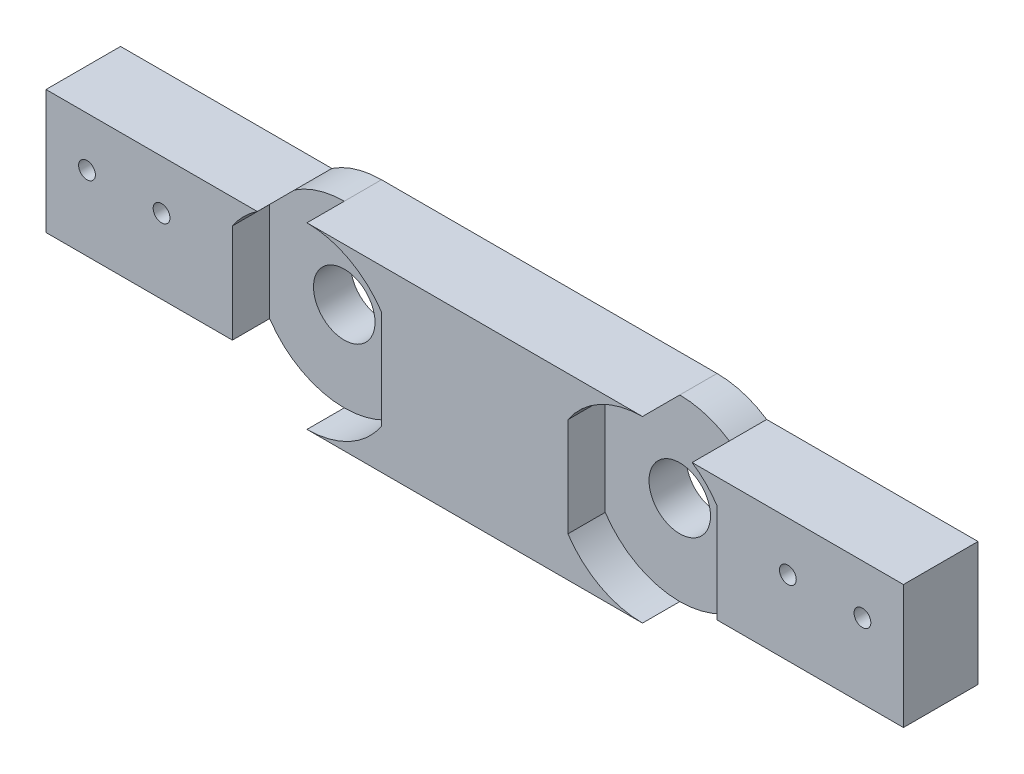
ISO-10303-21;
HEADER;
FILE_DESCRIPTION(('STEP AP214'),'2;1');
FILE_NAME('part.step','',(''),(''),'','','');
FILE_SCHEMA(('AUTOMOTIVE_DESIGN { 1 0 10303 214 1 1 1 1 }'));
ENDSEC;
DATA;
#1=APPLICATION_CONTEXT('core data for automotive mechanical design processes');
#2=APPLICATION_PROTOCOL_DEFINITION('international standard','automotive_design',2000,#1);
#3=PRODUCT_CONTEXT('',#1,'mechanical');
#4=PRODUCT('Part','Part','',(#3));
#5=PRODUCT_RELATED_PRODUCT_CATEGORY('part','',(#4));
#6=PRODUCT_DEFINITION_FORMATION('','',#4);
#7=PRODUCT_DEFINITION_CONTEXT('part definition',#1,'design');
#8=PRODUCT_DEFINITION('design','',#6,#7);
#9=PRODUCT_DEFINITION_SHAPE('','',#8);
#10=(LENGTH_UNIT() NAMED_UNIT(*) SI_UNIT(.MILLI.,.METRE.));
#11=(NAMED_UNIT(*) PLANE_ANGLE_UNIT() SI_UNIT($,.RADIAN.));
#12=(NAMED_UNIT(*) SI_UNIT($,.STERADIAN.) SOLID_ANGLE_UNIT());
#13=UNCERTAINTY_MEASURE_WITH_UNIT(LENGTH_MEASURE(1.E-05),#10,'distance_accuracy_value','');
#14=(GEOMETRIC_REPRESENTATION_CONTEXT(3) GLOBAL_UNCERTAINTY_ASSIGNED_CONTEXT((#13)) GLOBAL_UNIT_ASSIGNED_CONTEXT((#10,
#11,#12)) REPRESENTATION_CONTEXT('',''));
#15=CARTESIAN_POINT('',(0.,0.,0.));
#16=DIRECTION('',(0.,0.,1.));
#17=DIRECTION('',(1.,0.,0.));
#18=AXIS2_PLACEMENT_3D('',#15,#16,#17);
#19=CARTESIAN_POINT('',(0.,0.,0.));
#20=DIRECTION('',(0.,0.,1.));
#21=DIRECTION('',(1.,0.,0.));
#22=AXIS2_PLACEMENT_3D('',#19,#20,#21);
#23=CYLINDRICAL_SURFACE('',#22,24.);
#24=DIRECTION('',(0.,0.,1.));
#25=VECTOR('',#24,1.);
#26=CARTESIAN_POINT('',(-13.3168656686531,19.9664991614216,0.));
#27=LINE('',#26,#25);
#28=CARTESIAN_POINT('',(-13.3168656686531,19.9664991614216,0.));
#29=VERTEX_POINT('',#28);
#30=CARTESIAN_POINT('',(-13.3168656686531,19.9664991614216,10.));
#31=VERTEX_POINT('',#30);
#32=EDGE_CURVE('E67',#29,#31,#27,.T.);
#33=ORIENTED_EDGE('',*,*,#32,.T.);
#34=CARTESIAN_POINT('',(0.,0.,10.));
#35=DIRECTION('',(0.,0.,1.));
#36=DIRECTION('',(1.,0.,0.));
#37=AXIS2_PLACEMENT_3D('',#34,#35,#36);
#38=CIRCLE('',#37,24.);
#39=CARTESIAN_POINT('',(0.,24.,10.));
#40=VERTEX_POINT('',#39);
#41=EDGE_CURVE('E428',#31,#40,#38,.F.);
#42=ORIENTED_EDGE('',*,*,#41,.T.);
#43=DIRECTION('',(0.,0.,1.));
#44=VECTOR('',#43,1.);
#45=CARTESIAN_POINT('',(0.,24.,0.));
#46=LINE('',#45,#44);
#47=CARTESIAN_POINT('',(0.,24.,0.));
#48=VERTEX_POINT('',#47);
#49=EDGE_CURVE('E459',#48,#40,#46,.T.);
#50=ORIENTED_EDGE('',*,*,#49,.F.);
#51=CARTESIAN_POINT('',(0.,0.,0.));
#52=DIRECTION('',(0.,0.,1.));
#53=DIRECTION('',(1.,0.,0.));
#54=AXIS2_PLACEMENT_3D('',#51,#52,#53);
#55=CIRCLE('',#54,24.);
#56=EDGE_CURVE('E62',#29,#48,#55,.F.);
#57=ORIENTED_EDGE('',*,*,#56,.F.);
#58=EDGE_LOOP('',(#33,#42,#50,#57));
#59=FACE_BOUND('',#58,.T.);
#60=ADVANCED_FACE('F44',(#59),#23,.T.);
#61=CARTESIAN_POINT('',(0.,0.,10.));
#62=DIRECTION('',(0.,0.,1.));
#63=DIRECTION('',(1.,0.,0.));
#64=AXIS2_PLACEMENT_3D('',#61,#62,#63);
#65=PLANE('',#64);
#66=CARTESIAN_POINT('',(90.,0.,10.));
#67=DIRECTION('',(0.,0.,1.));
#68=DIRECTION('',(1.,0.,0.));
#69=AXIS2_PLACEMENT_3D('',#66,#67,#68);
#70=CIRCLE('',#69,8.25000000000001);
#71=CARTESIAN_POINT('',(98.25,0.,10.));
#72=VERTEX_POINT('',#71);
#73=EDGE_CURVE('E468',#72,#72,#70,.T.);
#74=ORIENTED_EDGE('',*,*,#73,.F.);
#75=EDGE_LOOP('',(#74));
#76=FACE_BOUND('',#75,.T.);
#77=CARTESIAN_POINT('',(90.,0.,10.));
#78=DIRECTION('',(0.,0.,1.));
#79=DIRECTION('',(1.,0.,0.));
#80=AXIS2_PLACEMENT_3D('',#77,#78,#79);
#81=CIRCLE('',#80,24.);
#82=CARTESIAN_POINT('',(110.,-13.2664991614216,10.));
#83=VERTEX_POINT('',#82);
#84=CARTESIAN_POINT('',(90.,-24.,10.));
#85=VERTEX_POINT('',#84);
#86=EDGE_CURVE('E437',#83,#85,#81,.F.);
#87=ORIENTED_EDGE('',*,*,#86,.F.);
#88=DIRECTION('',(0.,-1.,0.));
#89=VECTOR('',#88,1.);
#90=CARTESIAN_POINT('',(110.,13.2664991614216,10.));
#91=LINE('',#90,#89);
#92=CARTESIAN_POINT('',(110.,13.2664991614216,10.));
#93=VERTEX_POINT('',#92);
#94=EDGE_CURVE('E309',#93,#83,#91,.T.);
#95=ORIENTED_EDGE('',*,*,#94,.F.);
#96=CARTESIAN_POINT('',(90.,0.,10.));
#97=DIRECTION('',(0.,0.,1.));
#98=DIRECTION('',(1.,0.,0.));
#99=AXIS2_PLACEMENT_3D('',#96,#97,#98);
#100=CIRCLE('',#99,24.);
#101=CARTESIAN_POINT('',(103.316865668653,19.9664991614216,10.));
#102=VERTEX_POINT('',#101);
#103=EDGE_CURVE('E450',#93,#102,#100,.T.);
#104=ORIENTED_EDGE('',*,*,#103,.T.);
#105=CARTESIAN_POINT('',(90.,24.,10.));
#106=VERTEX_POINT('',#105);
#107=EDGE_CURVE('E415',#102,#106,#100,.T.);
#108=ORIENTED_EDGE('',*,*,#107,.T.);
#109=CARTESIAN_POINT('',(90.,0.,10.));
#110=DIRECTION('',(0.,0.,-1.));
#111=DIRECTION('',(1.,0.,0.));
#112=AXIS2_PLACEMENT_3D('',#109,#110,#111);
#113=CIRCLE('',#112,24.0000000000001);
#114=CARTESIAN_POINT('',(70.,13.2664991614216,10.));
#115=VERTEX_POINT('',#114);
#116=EDGE_CURVE('E373',#115,#106,#113,.T.);
#117=ORIENTED_EDGE('',*,*,#116,.F.);
#118=DIRECTION('',(0.,1.,0.));
#119=VECTOR('',#118,1.);
#120=CARTESIAN_POINT('',(70.,-13.2664991614216,10.));
#121=LINE('',#120,#119);
#122=CARTESIAN_POINT('',(70.,-13.2664991614216,10.));
#123=VERTEX_POINT('',#122);
#124=EDGE_CURVE('E369',#123,#115,#121,.T.);
#125=ORIENTED_EDGE('',*,*,#124,.F.);
#126=CARTESIAN_POINT('',(90.,0.,10.));
#127=DIRECTION('',(0.,0.,-1.));
#128=DIRECTION('',(-1.,0.,0.));
#129=AXIS2_PLACEMENT_3D('',#126,#127,#128);
#130=CIRCLE('',#129,24.);
#131=EDGE_CURVE('E365',#85,#123,#130,.T.);
#132=ORIENTED_EDGE('',*,*,#131,.F.);
#133=EDGE_LOOP('',(#87,#95,#104,#108,#117,#125,#132));
#134=FACE_BOUND('',#133,.T.);
#135=ADVANCED_FACE('F514',(#76,#134),#65,.T.);
#136=DIRECTION('',(0.,-1.,0.));
#137=VECTOR('',#136,1.);
#138=CARTESIAN_POINT('',(-20.,13.2664991614216,10.));
#139=LINE('',#138,#137);
#140=CARTESIAN_POINT('',(-20.,13.2664991614216,10.));
#141=VERTEX_POINT('',#140);
#142=CARTESIAN_POINT('',(-20.,-13.2664991614216,10.));
#143=VERTEX_POINT('',#142);
#144=EDGE_CURVE('E276',#141,#143,#139,.T.);
#145=ORIENTED_EDGE('',*,*,#144,.T.);
#146=CARTESIAN_POINT('',(0.,0.,10.));
#147=DIRECTION('',(0.,0.,1.));
#148=DIRECTION('',(1.,0.,0.));
#149=AXIS2_PLACEMENT_3D('',#146,#147,#148);
#150=CIRCLE('',#149,24.);
#151=CARTESIAN_POINT('',(0.,-24.,10.));
#152=VERTEX_POINT('',#151);
#153=EDGE_CURVE('E420',#143,#152,#150,.T.);
#154=ORIENTED_EDGE('',*,*,#153,.T.);
#155=CARTESIAN_POINT('',(0.,0.,10.));
#156=DIRECTION('',(0.,0.,-1.));
#157=DIRECTION('',(1.,0.,0.));
#158=AXIS2_PLACEMENT_3D('',#155,#156,#157);
#159=CIRCLE('',#158,24.);
#160=CARTESIAN_POINT('',(20.,-13.2664991614216,10.));
#161=VERTEX_POINT('',#160);
#162=EDGE_CURVE('E334',#161,#152,#159,.T.);
#163=ORIENTED_EDGE('',*,*,#162,.F.);
#164=DIRECTION('',(0.,-1.,0.));
#165=VECTOR('',#164,1.);
#166=CARTESIAN_POINT('',(20.,-13.2664991614216,10.));
#167=LINE('',#166,#165);
#168=CARTESIAN_POINT('',(20.,13.2664991614216,10.));
#169=VERTEX_POINT('',#168);
#170=EDGE_CURVE('E340',#169,#161,#167,.T.);
#171=ORIENTED_EDGE('',*,*,#170,.F.);
#172=CARTESIAN_POINT('',(0.,0.,10.));
#173=DIRECTION('',(0.,0.,-1.));
#174=DIRECTION('',(-1.,0.,0.));
#175=AXIS2_PLACEMENT_3D('',#172,#173,#174);
#176=CIRCLE('',#175,24.);
#177=EDGE_CURVE('E377',#40,#169,#176,.T.);
#178=ORIENTED_EDGE('',*,*,#177,.F.);
#179=ORIENTED_EDGE('',*,*,#41,.F.);
#180=EDGE_CURVE('E460',#141,#31,#38,.F.);
#181=ORIENTED_EDGE('',*,*,#180,.F.);
#182=EDGE_LOOP('',(#145,#154,#163,#171,#178,#179,#181));
#183=FACE_BOUND('',#182,.T.);
#184=CARTESIAN_POINT('',(0.,0.,10.));
#185=DIRECTION('',(0.,0.,1.));
#186=DIRECTION('',(1.,0.,0.));
#187=AXIS2_PLACEMENT_3D('',#184,#185,#186);
#188=CIRCLE('',#187,8.25);
#189=CARTESIAN_POINT('',(8.25,0.,10.));
#190=VERTEX_POINT('',#189);
#191=EDGE_CURVE('E476',#190,#190,#188,.T.);
#192=ORIENTED_EDGE('',*,*,#191,.F.);
#193=EDGE_LOOP('',(#192));
#194=FACE_BOUND('',#193,.T.);
#195=ADVANCED_FACE('F519',(#183,#194),#65,.T.);
#196=CARTESIAN_POINT('',(0.,0.,0.));
#197=DIRECTION('',(0.,0.,1.));
#198=DIRECTION('',(1.,0.,0.));
#199=AXIS2_PLACEMENT_3D('',#196,#197,#198);
#200=PLANE('',#199);
#201=CARTESIAN_POINT('',(90.,0.,0.));
#202=DIRECTION('',(0.,0.,1.));
#203=DIRECTION('',(1.,0.,0.));
#204=AXIS2_PLACEMENT_3D('',#201,#202,#203);
#205=CIRCLE('',#204,24.);
#206=CARTESIAN_POINT('',(103.316865668653,19.9664991614216,0.));
#207=VERTEX_POINT('',#206);
#208=CARTESIAN_POINT('',(90.,24.,0.));
#209=VERTEX_POINT('',#208);
#210=EDGE_CURVE('E223',#207,#209,#205,.T.);
#211=ORIENTED_EDGE('',*,*,#210,.F.);
#212=DIRECTION('',(-1.,0.,0.));
#213=VECTOR('',#212,1.);
#214=CARTESIAN_POINT('',(90.,19.9664991614216,0.));
#215=LINE('',#214,#213);
#216=CARTESIAN_POINT('',(160.,19.9664991614216,0.));
#217=VERTEX_POINT('',#216);
#218=EDGE_CURVE('E212',#217,#207,#215,.T.);
#219=ORIENTED_EDGE('',*,*,#218,.F.);
#220=DIRECTION('',(0.,1.,0.));
#221=VECTOR('',#220,1.);
#222=CARTESIAN_POINT('',(160.,-13.2664991614216,0.));
#223=LINE('',#222,#221);
#224=CARTESIAN_POINT('',(160.,-13.2664991614216,0.));
#225=VERTEX_POINT('',#224);
#226=EDGE_CURVE('E195',#225,#217,#223,.T.);
#227=ORIENTED_EDGE('',*,*,#226,.F.);
#228=DIRECTION('',(-1.,0.,0.));
#229=VECTOR('',#228,1.);
#230=CARTESIAN_POINT('',(160.,-13.2664991614216,0.));
#231=LINE('',#230,#229);
#232=CARTESIAN_POINT('',(110.,-13.2664991614216,0.));
#233=VERTEX_POINT('',#232);
#234=EDGE_CURVE('E207',#225,#233,#231,.T.);
#235=ORIENTED_EDGE('',*,*,#234,.T.);
#236=CARTESIAN_POINT('',(90.,0.,0.));
#237=DIRECTION('',(0.,0.,1.));
#238=DIRECTION('',(1.,0.,0.));
#239=AXIS2_PLACEMENT_3D('',#236,#237,#238);
#240=CIRCLE('',#239,24.);
#241=CARTESIAN_POINT('',(90.,-24.,0.));
#242=VERTEX_POINT('',#241);
#243=EDGE_CURVE('E432',#233,#242,#240,.F.);
#244=ORIENTED_EDGE('',*,*,#243,.T.);
#245=DIRECTION('',(1.,0.,0.));
#246=VECTOR('',#245,1.);
#247=CARTESIAN_POINT('',(-20.,-24.,0.));
#248=LINE('',#247,#246);
#249=CARTESIAN_POINT('',(0.,-24.,0.));
#250=VERTEX_POINT('',#249);
#251=EDGE_CURVE('E11',#250,#242,#248,.T.);
#252=ORIENTED_EDGE('',*,*,#251,.F.);
#253=CARTESIAN_POINT('',(0.,0.,0.));
#254=DIRECTION('',(0.,0.,1.));
#255=DIRECTION('',(1.,0.,0.));
#256=AXIS2_PLACEMENT_3D('',#253,#254,#255);
#257=CIRCLE('',#256,24.);
#258=CARTESIAN_POINT('',(-20.,-13.2664991614216,0.));
#259=VERTEX_POINT('',#258);
#260=EDGE_CURVE('E416',#259,#250,#257,.T.);
#261=ORIENTED_EDGE('',*,*,#260,.F.);
#262=DIRECTION('',(1.,0.,0.));
#263=VECTOR('',#262,1.);
#264=CARTESIAN_POINT('',(-70.,-13.2664991614216,0.));
#265=LINE('',#264,#263);
#266=CARTESIAN_POINT('',(-70.,-13.2664991614216,0.));
#267=VERTEX_POINT('',#266);
#268=EDGE_CURVE('E305',#267,#259,#265,.T.);
#269=ORIENTED_EDGE('',*,*,#268,.F.);
#270=DIRECTION('',(0.,1.,0.));
#271=VECTOR('',#270,1.);
#272=CARTESIAN_POINT('',(-70.,-13.2664991614216,0.));
#273=LINE('',#272,#271);
#274=CARTESIAN_POINT('',(-70.,19.9664991614216,0.));
#275=VERTEX_POINT('',#274);
#276=EDGE_CURVE('E298',#267,#275,#273,.T.);
#277=ORIENTED_EDGE('',*,*,#276,.T.);
#278=DIRECTION('',(1.,0.,0.));
#279=VECTOR('',#278,1.);
#280=CARTESIAN_POINT('',(0.,19.9664991614216,0.));
#281=LINE('',#280,#279);
#282=EDGE_CURVE('E245',#275,#29,#281,.T.);
#283=ORIENTED_EDGE('',*,*,#282,.T.);
#284=ORIENTED_EDGE('',*,*,#56,.T.);
#285=DIRECTION('',(-1.,0.,0.));
#286=VECTOR('',#285,1.);
#287=CARTESIAN_POINT('',(-20.,24.,0.));
#288=LINE('',#287,#286);
#289=EDGE_CURVE('E54',#209,#48,#288,.T.);
#290=ORIENTED_EDGE('',*,*,#289,.F.);
#291=EDGE_LOOP('',(#211,#219,#227,#235,#244,#252,#261,#269,#277,#283,#284,#290));
#292=FACE_BOUND('',#291,.T.);
#293=CARTESIAN_POINT('',(149.,6.7335008385784,0.));
#294=DIRECTION('',(0.,0.,1.));
#295=DIRECTION('',(1.,0.,0.));
#296=AXIS2_PLACEMENT_3D('',#293,#294,#295);
#297=CIRCLE('',#296,2.25);
#298=CARTESIAN_POINT('',(151.25,6.7335008385784,0.));
#299=VERTEX_POINT('',#298);
#300=EDGE_CURVE('E235',#299,#299,#297,.T.);
#301=ORIENTED_EDGE('',*,*,#300,.T.);
#302=EDGE_LOOP('',(#301));
#303=FACE_BOUND('',#302,.T.);
#304=CARTESIAN_POINT('',(129.,6.7335008385784,0.));
#305=DIRECTION('',(0.,0.,1.));
#306=DIRECTION('',(1.,0.,0.));
#307=AXIS2_PLACEMENT_3D('',#304,#305,#306);
#308=CIRCLE('',#307,2.25);
#309=CARTESIAN_POINT('',(131.25,6.7335008385784,0.));
#310=VERTEX_POINT('',#309);
#311=EDGE_CURVE('E240',#310,#310,#308,.T.);
#312=ORIENTED_EDGE('',*,*,#311,.T.);
#313=EDGE_LOOP('',(#312));
#314=FACE_BOUND('',#313,.T.);
#315=CARTESIAN_POINT('',(-59.,6.7335008385784,0.));
#316=DIRECTION('',(0.,0.,1.));
#317=DIRECTION('',(1.,0.,0.));
#318=AXIS2_PLACEMENT_3D('',#315,#316,#317);
#319=CIRCLE('',#318,2.25);
#320=CARTESIAN_POINT('',(-56.75,6.7335008385784,0.));
#321=VERTEX_POINT('',#320);
#322=EDGE_CURVE('E261',#321,#321,#319,.T.);
#323=ORIENTED_EDGE('',*,*,#322,.T.);
#324=EDGE_LOOP('',(#323));
#325=FACE_BOUND('',#324,.T.);
#326=CARTESIAN_POINT('',(-39.,6.7335008385784,0.));
#327=DIRECTION('',(0.,0.,1.));
#328=DIRECTION('',(1.,0.,0.));
#329=AXIS2_PLACEMENT_3D('',#326,#327,#328);
#330=CIRCLE('',#329,2.25);
#331=CARTESIAN_POINT('',(-36.75,6.7335008385784,0.));
#332=VERTEX_POINT('',#331);
#333=EDGE_CURVE('E268',#332,#332,#330,.T.);
#334=ORIENTED_EDGE('',*,*,#333,.T.);
#335=EDGE_LOOP('',(#334));
#336=FACE_BOUND('',#335,.T.);
#337=CARTESIAN_POINT('',(0.,0.,0.));
#338=DIRECTION('',(0.,0.,1.));
#339=DIRECTION('',(1.,0.,0.));
#340=AXIS2_PLACEMENT_3D('',#337,#338,#339);
#341=CIRCLE('',#340,8.25);
#342=CARTESIAN_POINT('',(8.25,0.,0.));
#343=VERTEX_POINT('',#342);
#344=EDGE_CURVE('E472',#343,#343,#341,.T.);
#345=ORIENTED_EDGE('',*,*,#344,.T.);
#346=EDGE_LOOP('',(#345));
#347=FACE_BOUND('',#346,.T.);
#348=CARTESIAN_POINT('',(90.,0.,0.));
#349=DIRECTION('',(0.,0.,1.));
#350=DIRECTION('',(1.,0.,0.));
#351=AXIS2_PLACEMENT_3D('',#348,#349,#350);
#352=CIRCLE('',#351,8.25000000000001);
#353=CARTESIAN_POINT('',(98.25,0.,0.));
#354=VERTEX_POINT('',#353);
#355=EDGE_CURVE('E467',#354,#354,#352,.T.);
#356=ORIENTED_EDGE('',*,*,#355,.T.);
#357=EDGE_LOOP('',(#356));
#358=FACE_BOUND('',#357,.T.);
#359=ADVANCED_FACE('F220',(#292,#303,#314,#325,#336,#347,#358),#200,.F.);
#360=CARTESIAN_POINT('',(-20.,24.,10.));
#361=DIRECTION('',(0.,-1.,0.));
#362=DIRECTION('',(0.,0.,-1.));
#363=AXIS2_PLACEMENT_3D('',#360,#361,#362);
#364=PLANE('',#363);
#365=DIRECTION('',(0.,0.,1.));
#366=VECTOR('',#365,1.);
#367=CARTESIAN_POINT('',(90.,24.,0.));
#368=LINE('',#367,#366);
#369=EDGE_CURVE('E441',#209,#106,#368,.T.);
#370=ORIENTED_EDGE('',*,*,#369,.F.);
#371=ORIENTED_EDGE('',*,*,#289,.T.);
#372=ORIENTED_EDGE('',*,*,#49,.T.);
#373=DIRECTION('',(0.,0.,-1.));
#374=VECTOR('',#373,1.);
#375=CARTESIAN_POINT('',(0.,24.,20.));
#376=LINE('',#375,#374);
#377=CARTESIAN_POINT('',(0.,24.,20.));
#378=VERTEX_POINT('',#377);
#379=EDGE_CURVE('E391',#378,#40,#376,.T.);
#380=ORIENTED_EDGE('',*,*,#379,.F.);
#381=DIRECTION('',(-1.,0.,0.));
#382=VECTOR('',#381,1.);
#383=CARTESIAN_POINT('',(0.,24.,20.));
#384=LINE('',#383,#382);
#385=CARTESIAN_POINT('',(90.,24.,20.));
#386=VERTEX_POINT('',#385);
#387=EDGE_CURVE('E352',#386,#378,#384,.T.);
#388=ORIENTED_EDGE('',*,*,#387,.F.);
#389=DIRECTION('',(0.,0.,-1.));
#390=VECTOR('',#389,1.);
#391=CARTESIAN_POINT('',(90.,24.,20.));
#392=LINE('',#391,#390);
#393=EDGE_CURVE('E395',#386,#106,#392,.T.);
#394=ORIENTED_EDGE('',*,*,#393,.T.);
#395=EDGE_LOOP('',(#370,#371,#372,#380,#388,#394));
#396=FACE_BOUND('',#395,.T.);
#397=ADVANCED_FACE('F46',(#396),#364,.F.);
#398=CARTESIAN_POINT('',(-20.,-24.,10.));
#399=DIRECTION('',(0.,1.,0.));
#400=DIRECTION('',(0.,0.,1.));
#401=AXIS2_PLACEMENT_3D('',#398,#399,#400);
#402=PLANE('',#401);
#403=DIRECTION('',(0.,0.,1.));
#404=VECTOR('',#403,1.);
#405=CARTESIAN_POINT('',(90.,-24.,0.));
#406=LINE('',#405,#404);
#407=EDGE_CURVE('E424',#242,#85,#406,.T.);
#408=ORIENTED_EDGE('',*,*,#407,.T.);
#409=DIRECTION('',(0.,0.,-1.));
#410=VECTOR('',#409,1.);
#411=CARTESIAN_POINT('',(90.,-24.0000000000001,20.));
#412=LINE('',#411,#410);
#413=CARTESIAN_POINT('',(90.,-24.0000000000001,20.));
#414=VERTEX_POINT('',#413);
#415=EDGE_CURVE('E407',#414,#85,#412,.T.);
#416=ORIENTED_EDGE('',*,*,#415,.F.);
#417=DIRECTION('',(1.,0.,0.));
#418=VECTOR('',#417,1.);
#419=CARTESIAN_POINT('',(0.,-24.,20.));
#420=LINE('',#419,#418);
#421=CARTESIAN_POINT('',(0.,-24.,20.));
#422=VERTEX_POINT('',#421);
#423=EDGE_CURVE('E339',#422,#414,#420,.T.);
#424=ORIENTED_EDGE('',*,*,#423,.F.);
#425=DIRECTION('',(0.,0.,-1.));
#426=VECTOR('',#425,1.);
#427=CARTESIAN_POINT('',(0.,-24.,20.));
#428=LINE('',#427,#426);
#429=EDGE_CURVE('E411',#422,#152,#428,.T.);
#430=ORIENTED_EDGE('',*,*,#429,.T.);
#431=DIRECTION('',(0.,0.,1.));
#432=VECTOR('',#431,1.);
#433=CARTESIAN_POINT('',(0.,-24.,0.));
#434=LINE('',#433,#432);
#435=EDGE_CURVE('E425',#250,#152,#434,.T.);
#436=ORIENTED_EDGE('',*,*,#435,.F.);
#437=ORIENTED_EDGE('',*,*,#251,.T.);
#438=EDGE_LOOP('',(#408,#416,#424,#430,#436,#437));
#439=FACE_BOUND('',#438,.T.);
#440=ADVANCED_FACE('F533',(#439),#402,.F.);
#441=CARTESIAN_POINT('',(0.,0.,10.));
#442=DIRECTION('',(0.,0.,-1.));
#443=DIRECTION('',(-1.,0.,0.));
#444=AXIS2_PLACEMENT_3D('',#441,#442,#443);
#445=CYLINDRICAL_SURFACE('',#444,8.25);
#446=ORIENTED_EDGE('',*,*,#191,.T.);
#447=EDGE_LOOP('',(#446));
#448=FACE_BOUND('',#447,.T.);
#449=ORIENTED_EDGE('',*,*,#344,.F.);
#450=EDGE_LOOP('',(#449));
#451=FACE_BOUND('',#450,.T.);
#452=ADVANCED_FACE('F530',(#448,#451),#445,.F.);
#453=CARTESIAN_POINT('',(90.,0.,10.));
#454=DIRECTION('',(0.,0.,-1.));
#455=DIRECTION('',(-1.,0.,0.));
#456=AXIS2_PLACEMENT_3D('',#453,#454,#455);
#457=CYLINDRICAL_SURFACE('',#456,8.25000000000001);
#458=ORIENTED_EDGE('',*,*,#73,.T.);
#459=EDGE_LOOP('',(#458));
#460=FACE_BOUND('',#459,.T.);
#461=ORIENTED_EDGE('',*,*,#355,.F.);
#462=EDGE_LOOP('',(#461));
#463=FACE_BOUND('',#462,.T.);
#464=ADVANCED_FACE('F526',(#460,#463),#457,.F.);
#465=CARTESIAN_POINT('',(0.,0.,0.));
#466=DIRECTION('',(0.,0.,1.));
#467=DIRECTION('',(1.,0.,0.));
#468=AXIS2_PLACEMENT_3D('',#465,#466,#467);
#469=CYLINDRICAL_SURFACE('',#468,24.);
#470=ORIENTED_EDGE('',*,*,#153,.F.);
#471=DIRECTION('',(0.,0.,1.));
#472=VECTOR('',#471,1.);
#473=CARTESIAN_POINT('',(-20.,-13.2664991614216,0.));
#474=LINE('',#473,#472);
#475=EDGE_CURVE('E419',#259,#143,#474,.T.);
#476=ORIENTED_EDGE('',*,*,#475,.F.);
#477=ORIENTED_EDGE('',*,*,#260,.T.);
#478=ORIENTED_EDGE('',*,*,#435,.T.);
#479=EDGE_LOOP('',(#470,#476,#477,#478));
#480=FACE_BOUND('',#479,.T.);
#481=ADVANCED_FACE('F529',(#480),#469,.T.);
#482=CARTESIAN_POINT('',(90.,0.,0.));
#483=DIRECTION('',(0.,0.,1.));
#484=DIRECTION('',(1.,0.,0.));
#485=AXIS2_PLACEMENT_3D('',#482,#483,#484);
#486=CYLINDRICAL_SURFACE('',#485,24.);
#487=ORIENTED_EDGE('',*,*,#86,.T.);
#488=ORIENTED_EDGE('',*,*,#407,.F.);
#489=ORIENTED_EDGE('',*,*,#243,.F.);
#490=DIRECTION('',(0.,0.,1.));
#491=VECTOR('',#490,1.);
#492=CARTESIAN_POINT('',(110.,-13.2664991614216,0.));
#493=LINE('',#492,#491);
#494=EDGE_CURVE('E436',#233,#83,#493,.T.);
#495=ORIENTED_EDGE('',*,*,#494,.T.);
#496=EDGE_LOOP('',(#487,#488,#489,#495));
#497=FACE_BOUND('',#496,.T.);
#498=ADVANCED_FACE('F641',(#497),#486,.T.);
#499=CARTESIAN_POINT('',(90.,0.,0.));
#500=DIRECTION('',(0.,0.,1.));
#501=DIRECTION('',(1.,0.,0.));
#502=AXIS2_PLACEMENT_3D('',#499,#500,#501);
#503=CYLINDRICAL_SURFACE('',#502,24.);
#504=DIRECTION('',(0.,0.,1.));
#505=VECTOR('',#504,1.);
#506=CARTESIAN_POINT('',(103.316865668653,19.9664991614216,0.));
#507=LINE('',#506,#505);
#508=EDGE_CURVE('E233',#207,#102,#507,.T.);
#509=ORIENTED_EDGE('',*,*,#508,.F.);
#510=ORIENTED_EDGE('',*,*,#210,.T.);
#511=ORIENTED_EDGE('',*,*,#369,.T.);
#512=ORIENTED_EDGE('',*,*,#107,.F.);
#513=EDGE_LOOP('',(#509,#510,#511,#512));
#514=FACE_BOUND('',#513,.T.);
#515=ADVANCED_FACE('F524',(#514),#503,.T.);
#516=CARTESIAN_POINT('',(0.,0.,20.));
#517=DIRECTION('',(0.,0.,-1.));
#518=DIRECTION('',(-1.,0.,0.));
#519=AXIS2_PLACEMENT_3D('',#516,#517,#518);
#520=CYLINDRICAL_SURFACE('',#519,24.);
#521=ORIENTED_EDGE('',*,*,#162,.T.);
#522=ORIENTED_EDGE('',*,*,#429,.F.);
#523=CARTESIAN_POINT('',(0.,0.,20.));
#524=DIRECTION('',(0.,0.,-1.));
#525=DIRECTION('',(1.,0.,0.));
#526=AXIS2_PLACEMENT_3D('',#523,#524,#525);
#527=CIRCLE('',#526,24.);
#528=CARTESIAN_POINT('',(20.,-13.2664991614216,20.));
#529=VERTEX_POINT('',#528);
#530=EDGE_CURVE('E335',#529,#422,#527,.T.);
#531=ORIENTED_EDGE('',*,*,#530,.F.);
#532=DIRECTION('',(0.,0.,-1.));
#533=VECTOR('',#532,1.);
#534=CARTESIAN_POINT('',(20.,-13.2664991614216,20.));
#535=LINE('',#534,#533);
#536=EDGE_CURVE('E361',#529,#161,#535,.T.);
#537=ORIENTED_EDGE('',*,*,#536,.T.);
#538=EDGE_LOOP('',(#521,#522,#531,#537));
#539=FACE_BOUND('',#538,.T.);
#540=ADVANCED_FACE('F560',(#539),#520,.F.);
#541=CARTESIAN_POINT('',(90.,0.,20.));
#542=DIRECTION('',(0.,0.,-1.));
#543=DIRECTION('',(-1.,0.,0.));
#544=AXIS2_PLACEMENT_3D('',#541,#542,#543);
#545=CYLINDRICAL_SURFACE('',#544,24.);
#546=ORIENTED_EDGE('',*,*,#131,.T.);
#547=DIRECTION('',(0.,0.,-1.));
#548=VECTOR('',#547,1.);
#549=CARTESIAN_POINT('',(70.,-13.2664991614216,20.));
#550=LINE('',#549,#548);
#551=CARTESIAN_POINT('',(70.,-13.2664991614216,20.));
#552=VERTEX_POINT('',#551);
#553=EDGE_CURVE('E403',#552,#123,#550,.T.);
#554=ORIENTED_EDGE('',*,*,#553,.F.);
#555=CARTESIAN_POINT('',(90.,0.,20.));
#556=DIRECTION('',(0.,0.,-1.));
#557=DIRECTION('',(-1.,0.,0.));
#558=AXIS2_PLACEMENT_3D('',#555,#556,#557);
#559=CIRCLE('',#558,24.);
#560=EDGE_CURVE('E343',#414,#552,#559,.T.);
#561=ORIENTED_EDGE('',*,*,#560,.F.);
#562=ORIENTED_EDGE('',*,*,#415,.T.);
#563=EDGE_LOOP('',(#546,#554,#561,#562));
#564=FACE_BOUND('',#563,.T.);
#565=ADVANCED_FACE('F551',(#564),#545,.F.);
#566=CARTESIAN_POINT('',(70.,-13.2664991614216,20.));
#567=DIRECTION('',(-1.,0.,0.));
#568=DIRECTION('',(0.,0.,1.));
#569=AXIS2_PLACEMENT_3D('',#566,#567,#568);
#570=PLANE('',#569);
#571=ORIENTED_EDGE('',*,*,#124,.T.);
#572=DIRECTION('',(0.,0.,-1.));
#573=VECTOR('',#572,1.);
#574=CARTESIAN_POINT('',(70.,13.2664991614216,20.));
#575=LINE('',#574,#573);
#576=CARTESIAN_POINT('',(70.,13.2664991614216,20.));
#577=VERTEX_POINT('',#576);
#578=EDGE_CURVE('E399',#577,#115,#575,.T.);
#579=ORIENTED_EDGE('',*,*,#578,.F.);
#580=DIRECTION('',(0.,1.,0.));
#581=VECTOR('',#580,1.);
#582=CARTESIAN_POINT('',(70.,-13.2664991614216,20.));
#583=LINE('',#582,#581);
#584=EDGE_CURVE('E346',#552,#577,#583,.T.);
#585=ORIENTED_EDGE('',*,*,#584,.F.);
#586=ORIENTED_EDGE('',*,*,#553,.T.);
#587=EDGE_LOOP('',(#571,#579,#585,#586));
#588=FACE_BOUND('',#587,.T.);
#589=ADVANCED_FACE('F631',(#588),#570,.F.);
#590=CARTESIAN_POINT('',(90.,0.,20.));
#591=DIRECTION('',(0.,0.,-1.));
#592=DIRECTION('',(-1.,0.,0.));
#593=AXIS2_PLACEMENT_3D('',#590,#591,#592);
#594=CYLINDRICAL_SURFACE('',#593,24.0000000000001);
#595=ORIENTED_EDGE('',*,*,#116,.T.);
#596=ORIENTED_EDGE('',*,*,#393,.F.);
#597=CARTESIAN_POINT('',(90.,0.,20.));
#598=DIRECTION('',(0.,0.,-1.));
#599=DIRECTION('',(1.,0.,0.));
#600=AXIS2_PLACEMENT_3D('',#597,#598,#599);
#601=CIRCLE('',#600,24.0000000000001);
#602=EDGE_CURVE('E349',#577,#386,#601,.T.);
#603=ORIENTED_EDGE('',*,*,#602,.F.);
#604=ORIENTED_EDGE('',*,*,#578,.T.);
#605=EDGE_LOOP('',(#595,#596,#603,#604));
#606=FACE_BOUND('',#605,.T.);
#607=ADVANCED_FACE('F628',(#606),#594,.F.);
#608=CARTESIAN_POINT('',(0.,0.,20.));
#609=DIRECTION('',(0.,0.,-1.));
#610=DIRECTION('',(-1.,0.,0.));
#611=AXIS2_PLACEMENT_3D('',#608,#609,#610);
#612=CYLINDRICAL_SURFACE('',#611,24.);
#613=ORIENTED_EDGE('',*,*,#177,.T.);
#614=DIRECTION('',(0.,0.,-1.));
#615=VECTOR('',#614,1.);
#616=CARTESIAN_POINT('',(20.,13.2664991614216,20.));
#617=LINE('',#616,#615);
#618=CARTESIAN_POINT('',(20.,13.2664991614216,20.));
#619=VERTEX_POINT('',#618);
#620=EDGE_CURVE('E387',#619,#169,#617,.T.);
#621=ORIENTED_EDGE('',*,*,#620,.F.);
#622=CARTESIAN_POINT('',(0.,0.,20.));
#623=DIRECTION('',(0.,0.,-1.));
#624=DIRECTION('',(-1.,0.,0.));
#625=AXIS2_PLACEMENT_3D('',#622,#623,#624);
#626=CIRCLE('',#625,24.);
#627=EDGE_CURVE('E355',#378,#619,#626,.T.);
#628=ORIENTED_EDGE('',*,*,#627,.F.);
#629=ORIENTED_EDGE('',*,*,#379,.T.);
#630=EDGE_LOOP('',(#613,#621,#628,#629));
#631=FACE_BOUND('',#630,.T.);
#632=ADVANCED_FACE('F571',(#631),#612,.F.);
#633=CARTESIAN_POINT('',(20.,-13.2664991614216,20.));
#634=DIRECTION('',(1.,0.,0.));
#635=DIRECTION('',(0.,0.,-1.));
#636=AXIS2_PLACEMENT_3D('',#633,#634,#635);
#637=PLANE('',#636);
#638=ORIENTED_EDGE('',*,*,#170,.T.);
#639=ORIENTED_EDGE('',*,*,#536,.F.);
#640=DIRECTION('',(0.,-1.,0.));
#641=VECTOR('',#640,1.);
#642=CARTESIAN_POINT('',(20.,-13.2664991614216,20.));
#643=LINE('',#642,#641);
#644=EDGE_CURVE('E358',#619,#529,#643,.T.);
#645=ORIENTED_EDGE('',*,*,#644,.F.);
#646=ORIENTED_EDGE('',*,*,#620,.T.);
#647=EDGE_LOOP('',(#638,#639,#645,#646));
#648=FACE_BOUND('',#647,.T.);
#649=ADVANCED_FACE('F566',(#648),#637,.F.);
#650=CARTESIAN_POINT('',(0.,0.,20.));
#651=DIRECTION('',(0.,0.,1.));
#652=DIRECTION('',(1.,0.,0.));
#653=AXIS2_PLACEMENT_3D('',#650,#651,#652);
#654=PLANE('',#653);
#655=ORIENTED_EDGE('',*,*,#530,.T.);
#656=ORIENTED_EDGE('',*,*,#423,.T.);
#657=ORIENTED_EDGE('',*,*,#560,.T.);
#658=ORIENTED_EDGE('',*,*,#584,.T.);
#659=ORIENTED_EDGE('',*,*,#602,.T.);
#660=ORIENTED_EDGE('',*,*,#387,.T.);
#661=ORIENTED_EDGE('',*,*,#627,.T.);
#662=ORIENTED_EDGE('',*,*,#644,.T.);
#663=EDGE_LOOP('',(#655,#656,#657,#658,#659,#660,#661,#662));
#664=FACE_BOUND('',#663,.T.);
#665=ADVANCED_FACE('F555',(#664),#654,.T.);
#666=CARTESIAN_POINT('',(160.,-13.2664991614216,10.));
#667=DIRECTION('',(0.,1.,0.));
#668=DIRECTION('',(0.,0.,1.));
#669=AXIS2_PLACEMENT_3D('',#666,#667,#668);
#670=PLANE('',#669);
#671=ORIENTED_EDGE('',*,*,#494,.F.);
#672=ORIENTED_EDGE('',*,*,#234,.F.);
#673=DIRECTION('',(0.,0.,-1.));
#674=VECTOR('',#673,1.);
#675=CARTESIAN_POINT('',(160.,-13.2664991614216,10.));
#676=LINE('',#675,#674);
#677=CARTESIAN_POINT('',(160.,-13.2664991614216,20.));
#678=VERTEX_POINT('',#677);
#679=EDGE_CURVE('E201',#678,#225,#676,.T.);
#680=ORIENTED_EDGE('',*,*,#679,.F.);
#681=DIRECTION('',(1.,0.,0.));
#682=VECTOR('',#681,1.);
#683=CARTESIAN_POINT('',(160.,-13.2664991614216,20.));
#684=LINE('',#683,#682);
#685=CARTESIAN_POINT('',(110.,-13.2664991614216,20.));
#686=VERTEX_POINT('',#685);
#687=EDGE_CURVE('E316',#686,#678,#684,.T.);
#688=ORIENTED_EDGE('',*,*,#687,.F.);
#689=DIRECTION('',(0.,0.,-1.));
#690=VECTOR('',#689,1.);
#691=CARTESIAN_POINT('',(110.,-13.2664991614216,20.));
#692=LINE('',#691,#690);
#693=EDGE_CURVE('E320',#686,#83,#692,.T.);
#694=ORIENTED_EDGE('',*,*,#693,.T.);
#695=EDGE_LOOP('',(#671,#672,#680,#688,#694));
#696=FACE_BOUND('',#695,.T.);
#697=ADVANCED_FACE('F618',(#696),#670,.F.);
#698=CARTESIAN_POINT('',(160.,0.,0.));
#699=DIRECTION('',(-1.,0.,0.));
#700=DIRECTION('',(0.,0.,1.));
#701=AXIS2_PLACEMENT_3D('',#698,#699,#700);
#702=PLANE('',#701);
#703=ORIENTED_EDGE('',*,*,#226,.T.);
#704=DIRECTION('',(0.,0.,1.));
#705=VECTOR('',#704,1.);
#706=CARTESIAN_POINT('',(160.,19.9664991614216,0.));
#707=LINE('',#706,#705);
#708=CARTESIAN_POINT('',(160.,19.9664991614216,20.));
#709=VERTEX_POINT('',#708);
#710=EDGE_CURVE('E199',#217,#709,#707,.T.);
#711=ORIENTED_EDGE('',*,*,#710,.T.);
#712=DIRECTION('',(0.,1.,0.));
#713=VECTOR('',#712,1.);
#714=CARTESIAN_POINT('',(160.,13.2664991614216,20.));
#715=LINE('',#714,#713);
#716=EDGE_CURVE('E310',#678,#709,#715,.T.);
#717=ORIENTED_EDGE('',*,*,#716,.F.);
#718=ORIENTED_EDGE('',*,*,#679,.T.);
#719=EDGE_LOOP('',(#703,#711,#717,#718));
#720=FACE_BOUND('',#719,.T.);
#721=ADVANCED_FACE('F197',(#720),#702,.F.);
#722=CARTESIAN_POINT('',(110.,13.2664991614216,20.));
#723=DIRECTION('',(1.,0.,0.));
#724=DIRECTION('',(0.,0.,-1.));
#725=AXIS2_PLACEMENT_3D('',#722,#723,#724);
#726=PLANE('',#725);
#727=ORIENTED_EDGE('',*,*,#94,.T.);
#728=ORIENTED_EDGE('',*,*,#693,.F.);
#729=DIRECTION('',(0.,-1.,0.));
#730=VECTOR('',#729,1.);
#731=CARTESIAN_POINT('',(110.,13.2664991614216,20.));
#732=LINE('',#731,#730);
#733=CARTESIAN_POINT('',(110.,13.2664991614216,20.));
#734=VERTEX_POINT('',#733);
#735=EDGE_CURVE('E313',#734,#686,#732,.T.);
#736=ORIENTED_EDGE('',*,*,#735,.F.);
#737=DIRECTION('',(0.,0.,-1.));
#738=VECTOR('',#737,1.);
#739=CARTESIAN_POINT('',(110.,13.2664991614216,20.));
#740=LINE('',#739,#738);
#741=EDGE_CURVE('E326',#734,#93,#740,.T.);
#742=ORIENTED_EDGE('',*,*,#741,.T.);
#743=EDGE_LOOP('',(#727,#728,#736,#742));
#744=FACE_BOUND('',#743,.T.);
#745=ADVANCED_FACE('F611',(#744),#726,.F.);
#746=CARTESIAN_POINT('',(0.,0.,20.));
#747=DIRECTION('',(0.,0.,-1.));
#748=DIRECTION('',(-1.,0.,0.));
#749=AXIS2_PLACEMENT_3D('',#746,#747,#748);
#750=PLANE('',#749);
#751=CARTESIAN_POINT('',(149.,6.7335008385784,20.));
#752=DIRECTION('',(0.,0.,-1.));
#753=DIRECTION('',(-1.,0.,0.));
#754=AXIS2_PLACEMENT_3D('',#751,#752,#753);
#755=CIRCLE('',#754,2.25);
#756=CARTESIAN_POINT('',(146.75,6.7335008385784,20.));
#757=VERTEX_POINT('',#756);
#758=EDGE_CURVE('E48',#757,#757,#755,.T.);
#759=ORIENTED_EDGE('',*,*,#758,.T.);
#760=EDGE_LOOP('',(#759));
#761=FACE_BOUND('',#760,.T.);
#762=CARTESIAN_POINT('',(129.,6.7335008385784,20.));
#763=DIRECTION('',(0.,0.,-1.));
#764=DIRECTION('',(-1.,0.,0.));
#765=AXIS2_PLACEMENT_3D('',#762,#763,#764);
#766=CIRCLE('',#765,2.25);
#767=CARTESIAN_POINT('',(126.75,6.7335008385784,20.));
#768=VERTEX_POINT('',#767);
#769=EDGE_CURVE('E244',#768,#768,#766,.T.);
#770=ORIENTED_EDGE('',*,*,#769,.T.);
#771=EDGE_LOOP('',(#770));
#772=FACE_BOUND('',#771,.T.);
#773=ORIENTED_EDGE('',*,*,#716,.T.);
#774=DIRECTION('',(-1.,0.,0.));
#775=VECTOR('',#774,1.);
#776=CARTESIAN_POINT('',(90.,19.9664991614216,20.));
#777=LINE('',#776,#775);
#778=CARTESIAN_POINT('',(103.316865668653,19.9664991614216,20.));
#779=VERTEX_POINT('',#778);
#780=EDGE_CURVE('E215',#709,#779,#777,.T.);
#781=ORIENTED_EDGE('',*,*,#780,.T.);
#782=CARTESIAN_POINT('',(90.,0.,20.));
#783=DIRECTION('',(0.,0.,-1.));
#784=DIRECTION('',(-1.,0.,0.));
#785=AXIS2_PLACEMENT_3D('',#782,#783,#784);
#786=CIRCLE('',#785,24.);
#787=EDGE_CURVE('E225',#734,#779,#786,.F.);
#788=ORIENTED_EDGE('',*,*,#787,.F.);
#789=ORIENTED_EDGE('',*,*,#735,.T.);
#790=ORIENTED_EDGE('',*,*,#687,.T.);
#791=EDGE_LOOP('',(#773,#781,#788,#789,#790));
#792=FACE_BOUND('',#791,.T.);
#793=ADVANCED_FACE('F492',(#761,#772,#792),#750,.F.);
#794=CARTESIAN_POINT('',(-70.,-13.2664991614216,10.));
#795=DIRECTION('',(0.,-1.,0.));
#796=DIRECTION('',(0.,0.,-1.));
#797=AXIS2_PLACEMENT_3D('',#794,#795,#796);
#798=PLANE('',#797);
#799=ORIENTED_EDGE('',*,*,#475,.T.);
#800=DIRECTION('',(0.,0.,-1.));
#801=VECTOR('',#800,1.);
#802=CARTESIAN_POINT('',(-20.,-13.2664991614216,20.));
#803=LINE('',#802,#801);
#804=CARTESIAN_POINT('',(-20.,-13.2664991614216,20.));
#805=VERTEX_POINT('',#804);
#806=EDGE_CURVE('E294',#805,#143,#803,.T.);
#807=ORIENTED_EDGE('',*,*,#806,.F.);
#808=DIRECTION('',(-1.,0.,0.));
#809=VECTOR('',#808,1.);
#810=CARTESIAN_POINT('',(-70.,-13.2664991614216,20.));
#811=LINE('',#810,#809);
#812=CARTESIAN_POINT('',(-70.,-13.2664991614216,20.));
#813=VERTEX_POINT('',#812);
#814=EDGE_CURVE('E280',#805,#813,#811,.T.);
#815=ORIENTED_EDGE('',*,*,#814,.T.);
#816=DIRECTION('',(0.,0.,-1.));
#817=VECTOR('',#816,1.);
#818=CARTESIAN_POINT('',(-70.,-13.2664991614216,10.));
#819=LINE('',#818,#817);
#820=EDGE_CURVE('E301',#813,#267,#819,.T.);
#821=ORIENTED_EDGE('',*,*,#820,.T.);
#822=ORIENTED_EDGE('',*,*,#268,.T.);
#823=EDGE_LOOP('',(#799,#807,#815,#821,#822));
#824=FACE_BOUND('',#823,.T.);
#825=ADVANCED_FACE('F595',(#824),#798,.T.);
#826=CARTESIAN_POINT('',(-70.,0.,0.));
#827=DIRECTION('',(1.,0.,0.));
#828=DIRECTION('',(0.,0.,1.));
#829=AXIS2_PLACEMENT_3D('',#826,#827,#828);
#830=PLANE('',#829);
#831=ORIENTED_EDGE('',*,*,#820,.F.);
#832=DIRECTION('',(0.,1.,0.));
#833=VECTOR('',#832,1.);
#834=CARTESIAN_POINT('',(-70.,13.2664991614216,20.));
#835=LINE('',#834,#833);
#836=CARTESIAN_POINT('',(-70.,19.9664991614216,20.));
#837=VERTEX_POINT('',#836);
#838=EDGE_CURVE('E277',#813,#837,#835,.T.);
#839=ORIENTED_EDGE('',*,*,#838,.T.);
#840=DIRECTION('',(0.,0.,1.));
#841=VECTOR('',#840,1.);
#842=CARTESIAN_POINT('',(-70.,19.9664991614216,0.));
#843=LINE('',#842,#841);
#844=EDGE_CURVE('E257',#275,#837,#843,.T.);
#845=ORIENTED_EDGE('',*,*,#844,.F.);
#846=ORIENTED_EDGE('',*,*,#276,.F.);
#847=EDGE_LOOP('',(#831,#839,#845,#846));
#848=FACE_BOUND('',#847,.T.);
#849=ADVANCED_FACE('F598',(#848),#830,.F.);
#850=CARTESIAN_POINT('',(-20.,13.2664991614216,20.));
#851=DIRECTION('',(1.,0.,0.));
#852=DIRECTION('',(0.,0.,-1.));
#853=AXIS2_PLACEMENT_3D('',#850,#851,#852);
#854=PLANE('',#853);
#855=ORIENTED_EDGE('',*,*,#144,.F.);
#856=DIRECTION('',(0.,0.,-1.));
#857=VECTOR('',#856,1.);
#858=CARTESIAN_POINT('',(-20.,13.2664991614216,20.));
#859=LINE('',#858,#857);
#860=CARTESIAN_POINT('',(-20.,13.2664991614216,20.));
#861=VERTEX_POINT('',#860);
#862=EDGE_CURVE('E288',#861,#141,#859,.T.);
#863=ORIENTED_EDGE('',*,*,#862,.F.);
#864=DIRECTION('',(0.,-1.,0.));
#865=VECTOR('',#864,1.);
#866=CARTESIAN_POINT('',(-20.,13.2664991614216,20.));
#867=LINE('',#866,#865);
#868=EDGE_CURVE('E284',#861,#805,#867,.T.);
#869=ORIENTED_EDGE('',*,*,#868,.T.);
#870=ORIENTED_EDGE('',*,*,#806,.T.);
#871=EDGE_LOOP('',(#855,#863,#869,#870));
#872=FACE_BOUND('',#871,.T.);
#873=ADVANCED_FACE('F591',(#872),#854,.T.);
#874=CARTESIAN_POINT('',(90.,0.,20.));
#875=DIRECTION('',(0.,0.,-1.));
#876=DIRECTION('',(1.,0.,0.));
#877=AXIS2_PLACEMENT_3D('',#874,#875,#876);
#878=PLANE('',#877);
#879=CARTESIAN_POINT('',(-59.,6.7335008385784,20.));
#880=DIRECTION('',(0.,0.,-1.));
#881=DIRECTION('',(-1.,0.,0.));
#882=AXIS2_PLACEMENT_3D('',#879,#880,#881);
#883=CIRCLE('',#882,2.25);
#884=CARTESIAN_POINT('',(-61.25,6.7335008385784,20.));
#885=VERTEX_POINT('',#884);
#886=EDGE_CURVE('E267',#885,#885,#883,.T.);
#887=ORIENTED_EDGE('',*,*,#886,.T.);
#888=EDGE_LOOP('',(#887));
#889=FACE_BOUND('',#888,.T.);
#890=CARTESIAN_POINT('',(-39.,6.7335008385784,20.));
#891=DIRECTION('',(0.,0.,-1.));
#892=DIRECTION('',(-1.,0.,0.));
#893=AXIS2_PLACEMENT_3D('',#890,#891,#892);
#894=CIRCLE('',#893,2.25);
#895=CARTESIAN_POINT('',(-41.25,6.7335008385784,20.));
#896=VERTEX_POINT('',#895);
#897=EDGE_CURVE('E272',#896,#896,#894,.T.);
#898=ORIENTED_EDGE('',*,*,#897,.T.);
#899=EDGE_LOOP('',(#898));
#900=FACE_BOUND('',#899,.T.);
#901=ORIENTED_EDGE('',*,*,#838,.F.);
#902=ORIENTED_EDGE('',*,*,#814,.F.);
#903=ORIENTED_EDGE('',*,*,#868,.F.);
#904=CARTESIAN_POINT('',(0.,0.,20.));
#905=DIRECTION('',(0.,0.,1.));
#906=DIRECTION('',(1.,0.,0.));
#907=AXIS2_PLACEMENT_3D('',#904,#905,#906);
#908=CIRCLE('',#907,24.);
#909=CARTESIAN_POINT('',(-13.3168656686531,19.9664991614216,20.));
#910=VERTEX_POINT('',#909);
#911=EDGE_CURVE('E250',#861,#910,#908,.F.);
#912=ORIENTED_EDGE('',*,*,#911,.T.);
#913=DIRECTION('',(1.,0.,0.));
#914=VECTOR('',#913,1.);
#915=CARTESIAN_POINT('',(0.,19.9664991614216,20.));
#916=LINE('',#915,#914);
#917=EDGE_CURVE('E249',#837,#910,#916,.T.);
#918=ORIENTED_EDGE('',*,*,#917,.F.);
#919=EDGE_LOOP('',(#901,#902,#903,#912,#918));
#920=FACE_BOUND('',#919,.T.);
#921=ADVANCED_FACE('F586',(#889,#900,#920),#878,.F.);
#922=CARTESIAN_POINT('',(-39.,6.7335008385784,30.));
#923=DIRECTION('',(0.,0.,1.));
#924=DIRECTION('',(1.,0.,0.));
#925=AXIS2_PLACEMENT_3D('',#922,#923,#924);
#926=CYLINDRICAL_SURFACE('',#925,2.25);
#927=ORIENTED_EDGE('',*,*,#333,.F.);
#928=EDGE_LOOP('',(#927));
#929=FACE_BOUND('',#928,.T.);
#930=ORIENTED_EDGE('',*,*,#897,.F.);
#931=EDGE_LOOP('',(#930));
#932=FACE_BOUND('',#931,.T.);
#933=ADVANCED_FACE('F756',(#929,#932),#926,.F.);
#934=CARTESIAN_POINT('',(-59.,6.7335008385784,30.));
#935=DIRECTION('',(0.,0.,1.));
#936=DIRECTION('',(1.,0.,0.));
#937=AXIS2_PLACEMENT_3D('',#934,#935,#936);
#938=CYLINDRICAL_SURFACE('',#937,2.25);
#939=ORIENTED_EDGE('',*,*,#322,.F.);
#940=EDGE_LOOP('',(#939));
#941=FACE_BOUND('',#940,.T.);
#942=ORIENTED_EDGE('',*,*,#886,.F.);
#943=EDGE_LOOP('',(#942));
#944=FACE_BOUND('',#943,.T.);
#945=ADVANCED_FACE('F746',(#941,#944),#938,.F.);
#946=CARTESIAN_POINT('',(0.,19.9664991614216,0.));
#947=DIRECTION('',(0.,-1.,0.));
#948=DIRECTION('',(0.,0.,-1.));
#949=AXIS2_PLACEMENT_3D('',#946,#947,#948);
#950=PLANE('',#949);
#951=ORIENTED_EDGE('',*,*,#917,.T.);
#952=EDGE_CURVE('E248',#31,#910,#27,.T.);
#953=ORIENTED_EDGE('',*,*,#952,.F.);
#954=ORIENTED_EDGE('',*,*,#32,.F.);
#955=ORIENTED_EDGE('',*,*,#282,.F.);
#956=ORIENTED_EDGE('',*,*,#844,.T.);
#957=EDGE_LOOP('',(#951,#953,#954,#955,#956));
#958=FACE_BOUND('',#957,.T.);
#959=ADVANCED_FACE('F508',(#958),#950,.F.);
#960=CARTESIAN_POINT('',(0.,0.,0.));
#961=DIRECTION('',(0.,0.,1.));
#962=DIRECTION('',(1.,0.,0.));
#963=AXIS2_PLACEMENT_3D('',#960,#961,#962);
#964=CYLINDRICAL_SURFACE('',#963,24.);
#965=ORIENTED_EDGE('',*,*,#862,.T.);
#966=ORIENTED_EDGE('',*,*,#180,.T.);
#967=ORIENTED_EDGE('',*,*,#952,.T.);
#968=ORIENTED_EDGE('',*,*,#911,.F.);
#969=EDGE_LOOP('',(#965,#966,#967,#968));
#970=FACE_BOUND('',#969,.T.);
#971=ADVANCED_FACE('F498',(#970),#964,.F.);
#972=CARTESIAN_POINT('',(129.,6.7335008385784,30.));
#973=DIRECTION('',(0.,0.,1.));
#974=DIRECTION('',(1.,0.,0.));
#975=AXIS2_PLACEMENT_3D('',#972,#973,#974);
#976=CYLINDRICAL_SURFACE('',#975,2.25);
#977=ORIENTED_EDGE('',*,*,#311,.F.);
#978=EDGE_LOOP('',(#977));
#979=FACE_BOUND('',#978,.T.);
#980=ORIENTED_EDGE('',*,*,#769,.F.);
#981=EDGE_LOOP('',(#980));
#982=FACE_BOUND('',#981,.T.);
#983=ADVANCED_FACE('F495',(#979,#982),#976,.F.);
#984=CARTESIAN_POINT('',(149.,6.7335008385784,30.));
#985=DIRECTION('',(0.,0.,1.));
#986=DIRECTION('',(1.,0.,0.));
#987=AXIS2_PLACEMENT_3D('',#984,#985,#986);
#988=CYLINDRICAL_SURFACE('',#987,2.25);
#989=ORIENTED_EDGE('',*,*,#300,.F.);
#990=EDGE_LOOP('',(#989));
#991=FACE_BOUND('',#990,.T.);
#992=ORIENTED_EDGE('',*,*,#758,.F.);
#993=EDGE_LOOP('',(#992));
#994=FACE_BOUND('',#993,.T.);
#995=ADVANCED_FACE('F497',(#991,#994),#988,.F.);
#996=CARTESIAN_POINT('',(90.,0.,0.));
#997=DIRECTION('',(0.,0.,1.));
#998=DIRECTION('',(1.,0.,0.));
#999=AXIS2_PLACEMENT_3D('',#996,#997,#998);
#1000=CYLINDRICAL_SURFACE('',#999,24.);
#1001=ORIENTED_EDGE('',*,*,#103,.F.);
#1002=ORIENTED_EDGE('',*,*,#741,.F.);
#1003=ORIENTED_EDGE('',*,*,#787,.T.);
#1004=EDGE_CURVE('E217',#102,#779,#507,.T.);
#1005=ORIENTED_EDGE('',*,*,#1004,.F.);
#1006=EDGE_LOOP('',(#1001,#1002,#1003,#1005));
#1007=FACE_BOUND('',#1006,.T.);
#1008=ADVANCED_FACE('F505',(#1007),#1000,.F.);
#1009=CARTESIAN_POINT('',(90.,19.9664991614216,0.));
#1010=DIRECTION('',(0.,1.,0.));
#1011=DIRECTION('',(0.,0.,1.));
#1012=AXIS2_PLACEMENT_3D('',#1009,#1010,#1011);
#1013=PLANE('',#1012);
#1014=ORIENTED_EDGE('',*,*,#780,.F.);
#1015=ORIENTED_EDGE('',*,*,#710,.F.);
#1016=ORIENTED_EDGE('',*,*,#218,.T.);
#1017=ORIENTED_EDGE('',*,*,#508,.T.);
#1018=ORIENTED_EDGE('',*,*,#1004,.T.);
#1019=EDGE_LOOP('',(#1014,#1015,#1016,#1017,#1018));
#1020=FACE_BOUND('',#1019,.T.);
#1021=ADVANCED_FACE('F210',(#1020),#1013,.T.);
#1022=CLOSED_SHELL('',(#60,#135,#195,#359,#397,#440,#452,#464,#481,#498,#515,#540,#565,#589,
#607,#632,#649,#665,#697,#721,#745,#793,#825,#849,#873,#921,#933,#945,#959,#971,#983,#995,#1008,#1021));
#1023=MANIFOLD_SOLID_BREP('B2',#1022);
#1024=ADVANCED_BREP_SHAPE_REPRESENTATION('',(#18,#1023),#14);
#1025=SHAPE_DEFINITION_REPRESENTATION(#9,#1024);
ENDSEC;
END-ISO-10303-21;
